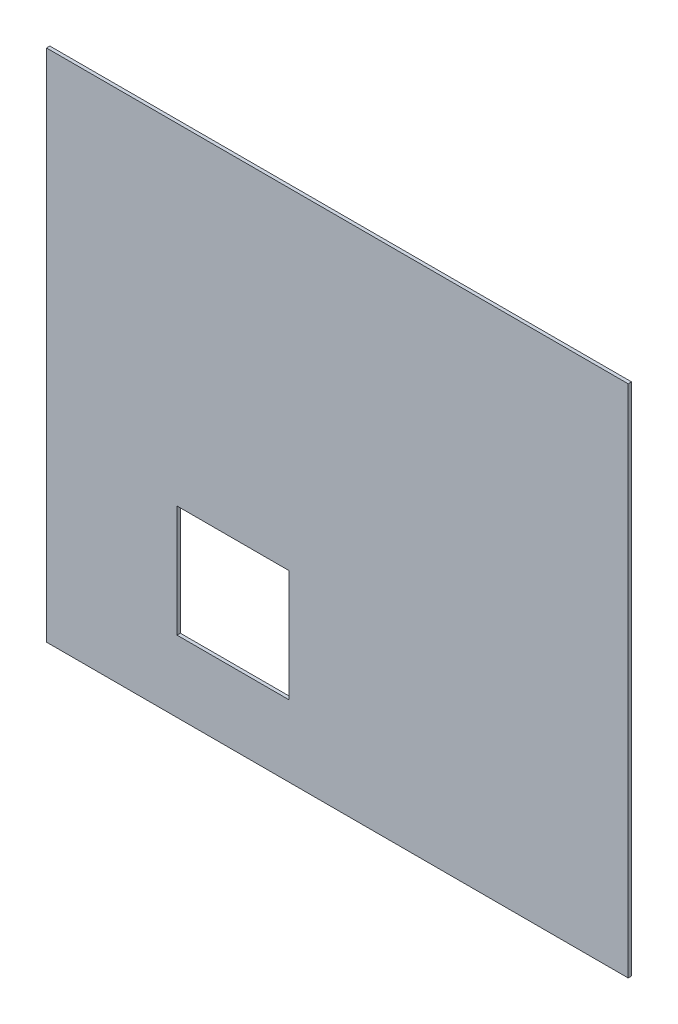
ISO-10303-21;
HEADER;
FILE_DESCRIPTION(('STEP AP214'),'2;1');
FILE_NAME('part.step','',(''),(''),'','','');
FILE_SCHEMA(('AUTOMOTIVE_DESIGN { 1 0 10303 214 1 1 1 1 }'));
ENDSEC;
DATA;
#1=APPLICATION_CONTEXT('core data for automotive mechanical design processes');
#2=APPLICATION_PROTOCOL_DEFINITION('international standard','automotive_design',2000,#1);
#3=PRODUCT_CONTEXT('',#1,'mechanical');
#4=PRODUCT('Part','Part','',(#3));
#5=PRODUCT_RELATED_PRODUCT_CATEGORY('part','',(#4));
#6=PRODUCT_DEFINITION_FORMATION('','',#4);
#7=PRODUCT_DEFINITION_CONTEXT('part definition',#1,'design');
#8=PRODUCT_DEFINITION('design','',#6,#7);
#9=PRODUCT_DEFINITION_SHAPE('','',#8);
#10=(LENGTH_UNIT() NAMED_UNIT(*) SI_UNIT(.MILLI.,.METRE.));
#11=(NAMED_UNIT(*) PLANE_ANGLE_UNIT() SI_UNIT($,.RADIAN.));
#12=(NAMED_UNIT(*) SI_UNIT($,.STERADIAN.) SOLID_ANGLE_UNIT());
#13=UNCERTAINTY_MEASURE_WITH_UNIT(LENGTH_MEASURE(1.E-05),#10,'distance_accuracy_value','');
#14=(GEOMETRIC_REPRESENTATION_CONTEXT(3) GLOBAL_UNCERTAINTY_ASSIGNED_CONTEXT((#13)) GLOBAL_UNIT_ASSIGNED_CONTEXT((#10,
#11,#12)) REPRESENTATION_CONTEXT('',''));
#15=CARTESIAN_POINT('',(0.,0.,0.));
#16=DIRECTION('',(0.,0.,1.));
#17=DIRECTION('',(1.,0.,0.));
#18=AXIS2_PLACEMENT_3D('',#15,#16,#17);
#19=CARTESIAN_POINT('',(260.,230.,3.));
#20=DIRECTION('',(-1.,0.,0.));
#21=DIRECTION('',(0.,-1.,0.));
#22=AXIS2_PLACEMENT_3D('',#19,#20,#21);
#23=PLANE('',#22);
#24=DIRECTION('',(0.,1.,0.));
#25=VECTOR('',#24,1.);
#26=CARTESIAN_POINT('',(260.,230.,0.));
#27=LINE('',#26,#25);
#28=CARTESIAN_POINT('',(260.,-230.,0.));
#29=VERTEX_POINT('',#28);
#30=CARTESIAN_POINT('',(260.,230.,0.));
#31=VERTEX_POINT('',#30);
#32=EDGE_CURVE('E135',#29,#31,#27,.T.);
#33=ORIENTED_EDGE('',*,*,#32,.T.);
#34=DIRECTION('',(0.,0.,-1.));
#35=VECTOR('',#34,1.);
#36=CARTESIAN_POINT('',(260.,230.,3.));
#37=LINE('',#36,#35);
#38=CARTESIAN_POINT('',(260.,230.,3.));
#39=VERTEX_POINT('',#38);
#40=EDGE_CURVE('E177',#39,#31,#37,.T.);
#41=ORIENTED_EDGE('',*,*,#40,.F.);
#42=DIRECTION('',(0.,1.,0.));
#43=VECTOR('',#42,1.);
#44=CARTESIAN_POINT('',(260.,230.,3.));
#45=LINE('',#44,#43);
#46=CARTESIAN_POINT('',(260.,-230.,3.));
#47=VERTEX_POINT('',#46);
#48=EDGE_CURVE('E140',#47,#39,#45,.T.);
#49=ORIENTED_EDGE('',*,*,#48,.F.);
#50=DIRECTION('',(0.,0.,-1.));
#51=VECTOR('',#50,1.);
#52=CARTESIAN_POINT('',(260.,-230.,3.));
#53=LINE('',#52,#51);
#54=EDGE_CURVE('E154',#47,#29,#53,.T.);
#55=ORIENTED_EDGE('',*,*,#54,.T.);
#56=EDGE_LOOP('',(#33,#41,#49,#55));
#57=FACE_BOUND('',#56,.T.);
#58=ADVANCED_FACE('F39',(#57),#23,.F.);
#59=CARTESIAN_POINT('',(-260.,230.,3.));
#60=DIRECTION('',(0.,-1.,0.));
#61=DIRECTION('',(0.,0.,-1.));
#62=AXIS2_PLACEMENT_3D('',#59,#60,#61);
#63=PLANE('',#62);
#64=DIRECTION('',(-1.,0.,0.));
#65=VECTOR('',#64,1.);
#66=CARTESIAN_POINT('',(-260.,230.,0.));
#67=LINE('',#66,#65);
#68=CARTESIAN_POINT('',(-260.,230.,0.));
#69=VERTEX_POINT('',#68);
#70=EDGE_CURVE('E158',#31,#69,#67,.T.);
#71=ORIENTED_EDGE('',*,*,#70,.T.);
#72=DIRECTION('',(0.,0.,-1.));
#73=VECTOR('',#72,1.);
#74=CARTESIAN_POINT('',(-260.,230.,3.));
#75=LINE('',#74,#73);
#76=CARTESIAN_POINT('',(-260.,230.,3.));
#77=VERTEX_POINT('',#76);
#78=EDGE_CURVE('E173',#77,#69,#75,.T.);
#79=ORIENTED_EDGE('',*,*,#78,.F.);
#80=DIRECTION('',(-1.,0.,0.));
#81=VECTOR('',#80,1.);
#82=CARTESIAN_POINT('',(-260.,230.,3.));
#83=LINE('',#82,#81);
#84=EDGE_CURVE('E144',#39,#77,#83,.T.);
#85=ORIENTED_EDGE('',*,*,#84,.F.);
#86=ORIENTED_EDGE('',*,*,#40,.T.);
#87=EDGE_LOOP('',(#71,#79,#85,#86));
#88=FACE_BOUND('',#87,.T.);
#89=ADVANCED_FACE('F205',(#88),#63,.F.);
#90=CARTESIAN_POINT('',(-260.,230.,3.));
#91=DIRECTION('',(1.,0.,0.));
#92=DIRECTION('',(0.,1.,0.));
#93=AXIS2_PLACEMENT_3D('',#90,#91,#92);
#94=PLANE('',#93);
#95=DIRECTION('',(0.,-1.,0.));
#96=VECTOR('',#95,1.);
#97=CARTESIAN_POINT('',(-260.,230.,0.));
#98=LINE('',#97,#96);
#99=CARTESIAN_POINT('',(-260.,-230.,0.));
#100=VERTEX_POINT('',#99);
#101=EDGE_CURVE('E161',#69,#100,#98,.T.);
#102=ORIENTED_EDGE('',*,*,#101,.T.);
#103=DIRECTION('',(0.,0.,-1.));
#104=VECTOR('',#103,1.);
#105=CARTESIAN_POINT('',(-260.,-230.,3.));
#106=LINE('',#105,#104);
#107=CARTESIAN_POINT('',(-260.,-230.,3.));
#108=VERTEX_POINT('',#107);
#109=EDGE_CURVE('E169',#108,#100,#106,.T.);
#110=ORIENTED_EDGE('',*,*,#109,.F.);
#111=DIRECTION('',(0.,-1.,0.));
#112=VECTOR('',#111,1.);
#113=CARTESIAN_POINT('',(-260.,230.,3.));
#114=LINE('',#113,#112);
#115=EDGE_CURVE('E148',#77,#108,#114,.T.);
#116=ORIENTED_EDGE('',*,*,#115,.F.);
#117=ORIENTED_EDGE('',*,*,#78,.T.);
#118=EDGE_LOOP('',(#102,#110,#116,#117));
#119=FACE_BOUND('',#118,.T.);
#120=ADVANCED_FACE('F210',(#119),#94,.F.);
#121=CARTESIAN_POINT('',(-260.,-230.,3.));
#122=DIRECTION('',(0.,1.,0.));
#123=DIRECTION('',(0.,0.,1.));
#124=AXIS2_PLACEMENT_3D('',#121,#122,#123);
#125=PLANE('',#124);
#126=DIRECTION('',(1.,0.,0.));
#127=VECTOR('',#126,1.);
#128=CARTESIAN_POINT('',(-260.,-230.,0.));
#129=LINE('',#128,#127);
#130=EDGE_CURVE('E145',#100,#29,#129,.T.);
#131=ORIENTED_EDGE('',*,*,#130,.T.);
#132=ORIENTED_EDGE('',*,*,#54,.F.);
#133=DIRECTION('',(1.,0.,0.));
#134=VECTOR('',#133,1.);
#135=CARTESIAN_POINT('',(-260.,-230.,3.));
#136=LINE('',#135,#134);
#137=EDGE_CURVE('E151',#108,#47,#136,.T.);
#138=ORIENTED_EDGE('',*,*,#137,.F.);
#139=ORIENTED_EDGE('',*,*,#109,.T.);
#140=EDGE_LOOP('',(#131,#132,#138,#139));
#141=FACE_BOUND('',#140,.T.);
#142=ADVANCED_FACE('F223',(#141),#125,.F.);
#143=CARTESIAN_POINT('',(0.,0.,3.));
#144=DIRECTION('',(0.,0.,1.));
#145=DIRECTION('',(1.,0.,0.));
#146=AXIS2_PLACEMENT_3D('',#143,#144,#145);
#147=PLANE('',#146);
#148=DIRECTION('',(0.,1.,0.));
#149=VECTOR('',#148,1.);
#150=CARTESIAN_POINT('',(-43.3500000000278,-66.226499350109,3.));
#151=LINE('',#150,#149);
#152=CARTESIAN_POINT('',(-43.3500000000278,-166.226499350109,3.));
#153=VERTEX_POINT('',#152);
#154=CARTESIAN_POINT('',(-43.3500000000278,-66.226499350109,3.));
#155=VERTEX_POINT('',#154);
#156=EDGE_CURVE('E54',#153,#155,#151,.T.);
#157=ORIENTED_EDGE('',*,*,#156,.F.);
#158=DIRECTION('',(1.,0.,0.));
#159=VECTOR('',#158,1.);
#160=CARTESIAN_POINT('',(-143.350000000028,-166.226499350109,3.));
#161=LINE('',#160,#159);
#162=CARTESIAN_POINT('',(-143.350000000028,-166.226499350109,3.));
#163=VERTEX_POINT('',#162);
#164=EDGE_CURVE('E125',#163,#153,#161,.T.);
#165=ORIENTED_EDGE('',*,*,#164,.F.);
#166=DIRECTION('',(0.,-1.,0.));
#167=VECTOR('',#166,1.);
#168=CARTESIAN_POINT('',(-143.350000000028,-66.226499350109,3.));
#169=LINE('',#168,#167);
#170=CARTESIAN_POINT('',(-143.350000000028,-66.226499350109,3.));
#171=VERTEX_POINT('',#170);
#172=EDGE_CURVE('E107',#171,#163,#169,.T.);
#173=ORIENTED_EDGE('',*,*,#172,.F.);
#174=DIRECTION('',(-1.,0.,0.));
#175=VECTOR('',#174,1.);
#176=CARTESIAN_POINT('',(-143.350000000028,-66.226499350109,3.));
#177=LINE('',#176,#175);
#178=EDGE_CURVE('E117',#155,#171,#177,.T.);
#179=ORIENTED_EDGE('',*,*,#178,.F.);
#180=EDGE_LOOP('',(#157,#165,#173,#179));
#181=FACE_BOUND('',#180,.T.);
#182=ORIENTED_EDGE('',*,*,#48,.T.);
#183=ORIENTED_EDGE('',*,*,#84,.T.);
#184=ORIENTED_EDGE('',*,*,#115,.T.);
#185=ORIENTED_EDGE('',*,*,#137,.T.);
#186=EDGE_LOOP('',(#182,#183,#184,#185));
#187=FACE_BOUND('',#186,.T.);
#188=ADVANCED_FACE('F122',(#181,#187),#147,.T.);
#189=CARTESIAN_POINT('',(0.,0.,0.));
#190=DIRECTION('',(0.,0.,1.));
#191=DIRECTION('',(1.,0.,0.));
#192=AXIS2_PLACEMENT_3D('',#189,#190,#191);
#193=PLANE('',#192);
#194=DIRECTION('',(1.,0.,0.));
#195=VECTOR('',#194,1.);
#196=CARTESIAN_POINT('',(0.,-166.226499350109,0.));
#197=LINE('',#196,#195);
#198=CARTESIAN_POINT('',(-143.350000000028,-166.226499350109,0.));
#199=VERTEX_POINT('',#198);
#200=CARTESIAN_POINT('',(-43.3500000000278,-166.226499350109,0.));
#201=VERTEX_POINT('',#200);
#202=EDGE_CURVE('E47',#199,#201,#197,.T.);
#203=ORIENTED_EDGE('',*,*,#202,.T.);
#204=DIRECTION('',(0.,1.,0.));
#205=VECTOR('',#204,1.);
#206=CARTESIAN_POINT('',(-43.3500000000278,0.,0.));
#207=LINE('',#206,#205);
#208=CARTESIAN_POINT('',(-43.3500000000278,-66.226499350109,0.));
#209=VERTEX_POINT('',#208);
#210=EDGE_CURVE('E11',#201,#209,#207,.T.);
#211=ORIENTED_EDGE('',*,*,#210,.T.);
#212=DIRECTION('',(-1.,0.,0.));
#213=VECTOR('',#212,1.);
#214=CARTESIAN_POINT('',(0.,-66.226499350109,0.));
#215=LINE('',#214,#213);
#216=CARTESIAN_POINT('',(-143.350000000028,-66.226499350109,0.));
#217=VERTEX_POINT('',#216);
#218=EDGE_CURVE('E181',#209,#217,#215,.T.);
#219=ORIENTED_EDGE('',*,*,#218,.T.);
#220=DIRECTION('',(0.,-1.,0.));
#221=VECTOR('',#220,1.);
#222=CARTESIAN_POINT('',(-143.350000000028,0.,0.));
#223=LINE('',#222,#221);
#224=EDGE_CURVE('E110',#217,#199,#223,.T.);
#225=ORIENTED_EDGE('',*,*,#224,.T.);
#226=EDGE_LOOP('',(#203,#211,#219,#225));
#227=FACE_BOUND('',#226,.T.);
#228=ORIENTED_EDGE('',*,*,#32,.F.);
#229=ORIENTED_EDGE('',*,*,#130,.F.);
#230=ORIENTED_EDGE('',*,*,#101,.F.);
#231=ORIENTED_EDGE('',*,*,#70,.F.);
#232=EDGE_LOOP('',(#228,#229,#230,#231));
#233=FACE_BOUND('',#232,.T.);
#234=ADVANCED_FACE('F188',(#227,#233),#193,.F.);
#235=CARTESIAN_POINT('',(-43.3500000000278,-66.226499350109,-7.));
#236=DIRECTION('',(1.,0.,0.));
#237=DIRECTION('',(0.,1.,0.));
#238=AXIS2_PLACEMENT_3D('',#235,#236,#237);
#239=PLANE('',#238);
#240=DIRECTION('',(0.,0.,1.));
#241=VECTOR('',#240,1.);
#242=CARTESIAN_POINT('',(-43.3500000000278,-166.226499350109,-7.));
#243=LINE('',#242,#241);
#244=EDGE_CURVE('E132',#201,#153,#243,.T.);
#245=ORIENTED_EDGE('',*,*,#244,.T.);
#246=ORIENTED_EDGE('',*,*,#156,.T.);
#247=DIRECTION('',(0.,0.,1.));
#248=VECTOR('',#247,1.);
#249=CARTESIAN_POINT('',(-43.3500000000278,-66.226499350109,-7.));
#250=LINE('',#249,#248);
#251=EDGE_CURVE('E114',#209,#155,#250,.T.);
#252=ORIENTED_EDGE('',*,*,#251,.F.);
#253=ORIENTED_EDGE('',*,*,#210,.F.);
#254=EDGE_LOOP('',(#245,#246,#252,#253));
#255=FACE_BOUND('',#254,.T.);
#256=ADVANCED_FACE('F193',(#255),#239,.F.);
#257=CARTESIAN_POINT('',(-143.350000000028,-166.226499350109,-7.));
#258=DIRECTION('',(0.,-1.,0.));
#259=DIRECTION('',(0.,0.,-1.));
#260=AXIS2_PLACEMENT_3D('',#257,#258,#259);
#261=PLANE('',#260);
#262=DIRECTION('',(0.,0.,1.));
#263=VECTOR('',#262,1.);
#264=CARTESIAN_POINT('',(-143.350000000028,-166.226499350109,-7.));
#265=LINE('',#264,#263);
#266=EDGE_CURVE('E113',#199,#163,#265,.T.);
#267=ORIENTED_EDGE('',*,*,#266,.T.);
#268=ORIENTED_EDGE('',*,*,#164,.T.);
#269=ORIENTED_EDGE('',*,*,#244,.F.);
#270=ORIENTED_EDGE('',*,*,#202,.F.);
#271=EDGE_LOOP('',(#267,#268,#269,#270));
#272=FACE_BOUND('',#271,.T.);
#273=ADVANCED_FACE('F192',(#272),#261,.F.);
#274=CARTESIAN_POINT('',(-143.350000000028,-66.226499350109,-7.));
#275=DIRECTION('',(-1.,0.,0.));
#276=DIRECTION('',(0.,0.,1.));
#277=AXIS2_PLACEMENT_3D('',#274,#275,#276);
#278=PLANE('',#277);
#279=DIRECTION('',(0.,0.,1.));
#280=VECTOR('',#279,1.);
#281=CARTESIAN_POINT('',(-143.350000000028,-66.226499350109,-7.));
#282=LINE('',#281,#280);
#283=EDGE_CURVE('E62',#217,#171,#282,.T.);
#284=ORIENTED_EDGE('',*,*,#283,.T.);
#285=ORIENTED_EDGE('',*,*,#172,.T.);
#286=ORIENTED_EDGE('',*,*,#266,.F.);
#287=ORIENTED_EDGE('',*,*,#224,.F.);
#288=EDGE_LOOP('',(#284,#285,#286,#287));
#289=FACE_BOUND('',#288,.T.);
#290=ADVANCED_FACE('F104',(#289),#278,.F.);
#291=CARTESIAN_POINT('',(-143.350000000028,-66.226499350109,-7.));
#292=DIRECTION('',(0.,1.,0.));
#293=DIRECTION('',(0.,0.,1.));
#294=AXIS2_PLACEMENT_3D('',#291,#292,#293);
#295=PLANE('',#294);
#296=ORIENTED_EDGE('',*,*,#251,.T.);
#297=ORIENTED_EDGE('',*,*,#178,.T.);
#298=ORIENTED_EDGE('',*,*,#283,.F.);
#299=ORIENTED_EDGE('',*,*,#218,.F.);
#300=EDGE_LOOP('',(#296,#297,#298,#299));
#301=FACE_BOUND('',#300,.T.);
#302=ADVANCED_FACE('F118',(#301),#295,.F.);
#303=CLOSED_SHELL('',(#58,#89,#120,#142,#188,#234,#256,#273,#290,#302));
#304=MANIFOLD_SOLID_BREP('B2',#303);
#305=ADVANCED_BREP_SHAPE_REPRESENTATION('',(#18,#304),#14);
#306=SHAPE_DEFINITION_REPRESENTATION(#9,#305);
ENDSEC;
END-ISO-10303-21;
